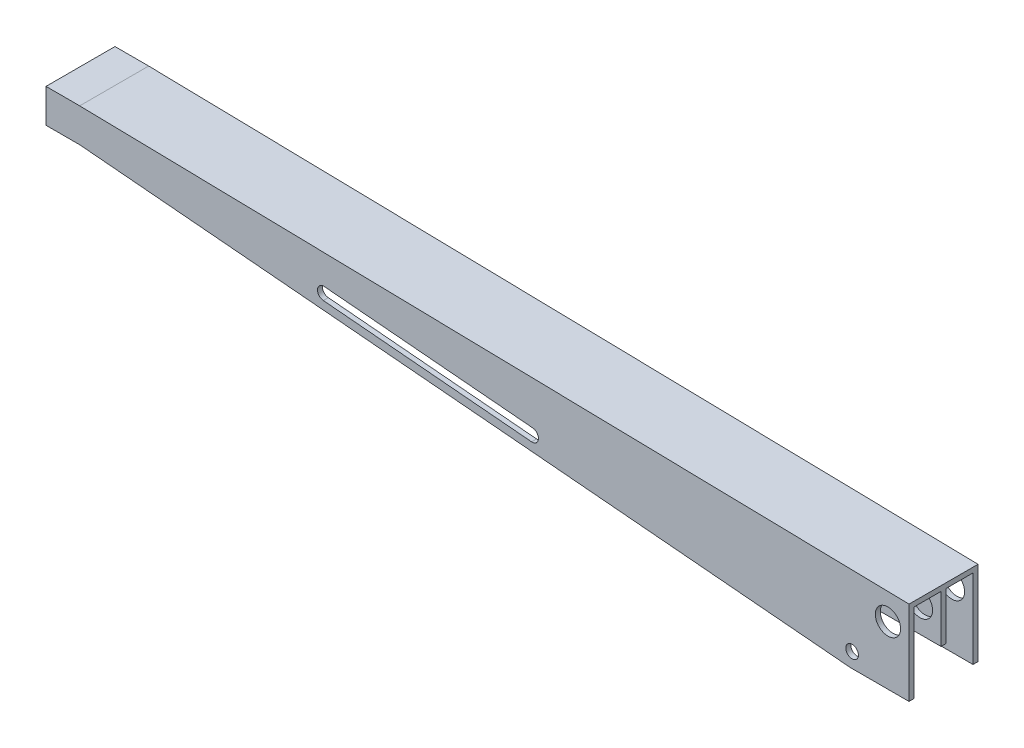
ISO-10303-21;
HEADER;
FILE_DESCRIPTION(('STEP AP214'),'2;1');
FILE_NAME('part.step','',(''),(''),'','','');
FILE_SCHEMA(('AUTOMOTIVE_DESIGN { 1 0 10303 214 1 1 1 1 }'));
ENDSEC;
DATA;
#1=APPLICATION_CONTEXT('core data for automotive mechanical design processes');
#2=APPLICATION_PROTOCOL_DEFINITION('international standard','automotive_design',2000,#1);
#3=PRODUCT_CONTEXT('',#1,'mechanical');
#4=PRODUCT('Part','Part','',(#3));
#5=PRODUCT_RELATED_PRODUCT_CATEGORY('part','',(#4));
#6=PRODUCT_DEFINITION_FORMATION('','',#4);
#7=PRODUCT_DEFINITION_CONTEXT('part definition',#1,'design');
#8=PRODUCT_DEFINITION('design','',#6,#7);
#9=PRODUCT_DEFINITION_SHAPE('','',#8);
#10=(LENGTH_UNIT() NAMED_UNIT(*) SI_UNIT(.MILLI.,.METRE.));
#11=(NAMED_UNIT(*) PLANE_ANGLE_UNIT() SI_UNIT($,.RADIAN.));
#12=(NAMED_UNIT(*) SI_UNIT($,.STERADIAN.) SOLID_ANGLE_UNIT());
#13=UNCERTAINTY_MEASURE_WITH_UNIT(LENGTH_MEASURE(1.E-05),#10,'distance_accuracy_value','');
#14=(GEOMETRIC_REPRESENTATION_CONTEXT(3) GLOBAL_UNCERTAINTY_ASSIGNED_CONTEXT((#13)) GLOBAL_UNIT_ASSIGNED_CONTEXT((#10,
#11,#12)) REPRESENTATION_CONTEXT('',''));
#15=CARTESIAN_POINT('',(0.,0.,0.));
#16=DIRECTION('',(0.,0.,1.));
#17=DIRECTION('',(1.,0.,0.));
#18=AXIS2_PLACEMENT_3D('',#15,#16,#17);
#19=CARTESIAN_POINT('',(0.,0.,177.8));
#20=DIRECTION('',(0.,0.,1.));
#21=DIRECTION('',(1.,0.,0.));
#22=AXIS2_PLACEMENT_3D('',#19,#20,#21);
#23=PLANE('',#22);
#24=DIRECTION('',(-0.999793348363563,0.0203288112779674,0.));
#25=VECTOR('',#24,1.);
#26=CARTESIAN_POINT('',(-15.,239.301894781674,177.8));
#27=LINE('',#26,#25);
#28=CARTESIAN_POINT('',(0.,238.996899584748,177.8));
#29=VERTEX_POINT('',#28);
#30=CARTESIAN_POINT('',(-2498.5524818399,289.8,177.8));
#31=VERTEX_POINT('',#30);
#32=EDGE_CURVE('E431',#29,#31,#27,.T.);
#33=ORIENTED_EDGE('',*,*,#32,.F.);
#34=DIRECTION('',(0.,1.,0.));
#35=VECTOR('',#34,1.);
#36=CARTESIAN_POINT('',(0.,0.,177.8));
#37=LINE('',#36,#35);
#38=CARTESIAN_POINT('',(0.,0.,177.8));
#39=VERTEX_POINT('',#38);
#40=EDGE_CURVE('E413',#39,#29,#37,.T.);
#41=ORIENTED_EDGE('',*,*,#40,.F.);
#42=DIRECTION('',(1.,0.,0.));
#43=VECTOR('',#42,1.);
#44=CARTESIAN_POINT('',(-177.8,0.,177.8));
#45=LINE('',#44,#43);
#46=CARTESIAN_POINT('',(-177.8,0.,177.8));
#47=VERTEX_POINT('',#46);
#48=EDGE_CURVE('E410',#47,#39,#45,.T.);
#49=ORIENTED_EDGE('',*,*,#48,.F.);
#50=DIRECTION('',(0.996188217209835,-0.0872297878725495,0.));
#51=VECTOR('',#50,1.);
#52=CARTESIAN_POINT('',(-2498.4,203.2,177.8));
#53=LINE('',#52,#51);
#54=CARTESIAN_POINT('',(-2498.4,203.2,177.8));
#55=VERTEX_POINT('',#54);
#56=EDGE_CURVE('E407',#55,#47,#53,.T.);
#57=ORIENTED_EDGE('',*,*,#56,.F.);
#58=DIRECTION('',(1.,0.,0.));
#59=VECTOR('',#58,1.);
#60=CARTESIAN_POINT('',(-2600.,203.2,177.8));
#61=LINE('',#60,#59);
#62=CARTESIAN_POINT('',(-2600.,203.2,177.8));
#63=VERTEX_POINT('',#62);
#64=EDGE_CURVE('E400',#63,#55,#61,.T.);
#65=ORIENTED_EDGE('',*,*,#64,.F.);
#66=DIRECTION('',(0.,-1.,0.));
#67=VECTOR('',#66,1.);
#68=CARTESIAN_POINT('',(-2600.,304.8,177.8));
#69=LINE('',#68,#67);
#70=CARTESIAN_POINT('',(-2600.,289.8,177.8));
#71=VERTEX_POINT('',#70);
#72=EDGE_CURVE('E418',#71,#63,#69,.T.);
#73=ORIENTED_EDGE('',*,*,#72,.F.);
#74=DIRECTION('',(-1.,0.,0.));
#75=VECTOR('',#74,1.);
#76=CARTESIAN_POINT('',(-2498.5524818399,289.8,177.8));
#77=LINE('',#76,#75);
#78=EDGE_CURVE('E492',#31,#71,#77,.T.);
#79=ORIENTED_EDGE('',*,*,#78,.F.);
#80=EDGE_LOOP('',(#33,#41,#49,#57,#65,#73,#79));
#81=FACE_BOUND('',#80,.T.);
#82=CARTESIAN_POINT('',(-63.5,176.782795881907,177.8));
#83=DIRECTION('',(0.,0.,1.));
#84=DIRECTION('',(1.,0.,0.));
#85=AXIS2_PLACEMENT_3D('',#82,#83,#84);
#86=CIRCLE('',#85,38.1);
#87=CARTESIAN_POINT('',(-25.4,176.782795881907,177.8));
#88=VERTEX_POINT('',#87);
#89=EDGE_CURVE('E353',#88,#88,#86,.T.);
#90=ORIENTED_EDGE('',*,*,#89,.T.);
#91=EDGE_LOOP('',(#90));
#92=FACE_BOUND('',#91,.T.);
#93=CARTESIAN_POINT('',(-171.45,44.45,177.8));
#94=DIRECTION('',(0.,0.,1.));
#95=DIRECTION('',(1.,0.,0.));
#96=AXIS2_PLACEMENT_3D('',#93,#94,#95);
#97=CIRCLE('',#96,19.05);
#98=CARTESIAN_POINT('',(-152.4,44.45,177.8));
#99=VERTEX_POINT('',#98);
#100=EDGE_CURVE('E318',#99,#99,#97,.T.);
#101=ORIENTED_EDGE('',*,*,#100,.T.);
#102=EDGE_LOOP('',(#101));
#103=FACE_BOUND('',#102,.T.);
#104=CARTESIAN_POINT('',(-1135.45885,127.812391799813,177.8));
#105=DIRECTION('',(0.,0.,1.));
#106=DIRECTION('',(1.,0.,0.));
#107=AXIS2_PLACEMENT_3D('',#104,#105,#106);
#108=CIRCLE('',#107,19.05);
#109=CARTESIAN_POINT('',(-1137.12057745897,108.835006261966,177.8));
#110=VERTEX_POINT('',#109);
#111=CARTESIAN_POINT('',(-1133.79712254103,146.78977733766,177.8));
#112=VERTEX_POINT('',#111);
#113=EDGE_CURVE('E327',#110,#112,#108,.T.);
#114=ORIENTED_EDGE('',*,*,#113,.T.);
#115=DIRECTION('',(-0.996188217209835,0.0872297878725497,0.));
#116=VECTOR('',#115,1.);
#117=CARTESIAN_POINT('',(4.12853039066169,47.1489548453224,177.8));
#118=LINE('',#117,#116);
#119=CARTESIAN_POINT('',(-1761.39569938322,201.744543697367,177.8));
#120=VERTEX_POINT('',#119);
#121=EDGE_CURVE('E324',#112,#120,#118,.T.);
#122=ORIENTED_EDGE('',*,*,#121,.T.);
#123=CARTESIAN_POINT('',(-1763.0574268422,182.767158159519,177.8));
#124=DIRECTION('',(0.,0.,1.));
#125=DIRECTION('',(1.,0.,0.));
#126=AXIS2_PLACEMENT_3D('',#123,#124,#125);
#127=CIRCLE('',#126,19.05);
#128=CARTESIAN_POINT('',(-1764.71915430117,163.789772621672,177.8));
#129=VERTEX_POINT('',#128);
#130=EDGE_CURVE('E319',#120,#129,#127,.T.);
#131=ORIENTED_EDGE('',*,*,#130,.T.);
#132=DIRECTION('',(0.996188217209835,-0.0872297878725497,0.));
#133=VECTOR('',#132,1.);
#134=CARTESIAN_POINT('',(0.805075472717551,9.19418376962768,177.8));
#135=LINE('',#134,#133);
#136=EDGE_CURVE('E315',#129,#110,#135,.T.);
#137=ORIENTED_EDGE('',*,*,#136,.T.);
#138=EDGE_LOOP('',(#114,#122,#131,#137));
#139=FACE_BOUND('',#138,.T.);
#140=ADVANCED_FACE('F64',(#81,#92,#103,#139),#23,.F.);
#141=CARTESIAN_POINT('',(-1135.45885,127.812391799813,192.8));
#142=DIRECTION('',(0.,0.,-1.));
#143=DIRECTION('',(-1.,0.,0.));
#144=AXIS2_PLACEMENT_3D('',#141,#142,#143);
#145=CYLINDRICAL_SURFACE('',#144,19.05);
#146=DIRECTION('',(0.,0.,-1.));
#147=VECTOR('',#146,1.);
#148=CARTESIAN_POINT('',(-1133.79712254103,146.78977733766,192.8));
#149=LINE('',#148,#147);
#150=CARTESIAN_POINT('',(-1133.79712254103,146.78977733766,192.8));
#151=VERTEX_POINT('',#150);
#152=EDGE_CURVE('E306',#151,#112,#149,.T.);
#153=ORIENTED_EDGE('',*,*,#152,.T.);
#154=ORIENTED_EDGE('',*,*,#113,.F.);
#155=DIRECTION('',(0.,0.,-1.));
#156=VECTOR('',#155,1.);
#157=CARTESIAN_POINT('',(-1137.12057745897,108.835006261966,192.8));
#158=LINE('',#157,#156);
#159=CARTESIAN_POINT('',(-1137.12057745897,108.835006261966,192.8));
#160=VERTEX_POINT('',#159);
#161=EDGE_CURVE('E288',#160,#110,#158,.T.);
#162=ORIENTED_EDGE('',*,*,#161,.F.);
#163=CARTESIAN_POINT('',(-1135.45885,127.812391799813,192.8));
#164=DIRECTION('',(0.,0.,-1.));
#165=DIRECTION('',(-1.,0.,0.));
#166=AXIS2_PLACEMENT_3D('',#163,#164,#165);
#167=CIRCLE('',#166,19.05);
#168=EDGE_CURVE('E293',#151,#160,#167,.T.);
#169=ORIENTED_EDGE('',*,*,#168,.F.);
#170=EDGE_LOOP('',(#153,#154,#162,#169));
#171=FACE_BOUND('',#170,.T.);
#172=ADVANCED_FACE('F562',(#171),#145,.F.);
#173=DIRECTION('',(0.,0.,-1.));
#174=VECTOR('',#173,1.);
#175=CARTESIAN_POINT('',(-1133.79712254103,146.78977733766,192.8));
#176=LINE('',#175,#174);
#177=CARTESIAN_POINT('',(-1133.79712254103,146.78977733766,-15.));
#178=VERTEX_POINT('',#177);
#179=CARTESIAN_POINT('',(-1133.79712254103,146.78977733766,0.));
#180=VERTEX_POINT('',#179);
#181=EDGE_CURVE('E332',#178,#180,#176,.F.);
#182=ORIENTED_EDGE('',*,*,#181,.F.);
#183=CARTESIAN_POINT('',(-1135.45885,127.812391799813,-15.));
#184=DIRECTION('',(0.,0.,-1.));
#185=DIRECTION('',(-1.,0.,0.));
#186=AXIS2_PLACEMENT_3D('',#183,#184,#185);
#187=CIRCLE('',#186,19.05);
#188=CARTESIAN_POINT('',(-1137.12057745897,108.835006261966,-15.));
#189=VERTEX_POINT('',#188);
#190=EDGE_CURVE('E345',#189,#178,#187,.F.);
#191=ORIENTED_EDGE('',*,*,#190,.F.);
#192=DIRECTION('',(0.,0.,-1.));
#193=VECTOR('',#192,1.);
#194=CARTESIAN_POINT('',(-1137.12057745897,108.835006261966,192.8));
#195=LINE('',#194,#193);
#196=CARTESIAN_POINT('',(-1137.12057745897,108.835006261966,0.));
#197=VERTEX_POINT('',#196);
#198=EDGE_CURVE('E309',#189,#197,#195,.F.);
#199=ORIENTED_EDGE('',*,*,#198,.T.);
#200=CARTESIAN_POINT('',(-1135.45885,127.812391799813,0.));
#201=DIRECTION('',(0.,0.,1.));
#202=DIRECTION('',(1.,0.,0.));
#203=AXIS2_PLACEMENT_3D('',#200,#201,#202);
#204=CIRCLE('',#203,19.05);
#205=EDGE_CURVE('E335',#197,#180,#204,.T.);
#206=ORIENTED_EDGE('',*,*,#205,.T.);
#207=EDGE_LOOP('',(#182,#191,#199,#206));
#208=FACE_BOUND('',#207,.T.);
#209=ADVANCED_FACE('F527',(#208),#145,.F.);
#210=CARTESIAN_POINT('',(-15.,239.301894781674,-2600.83256824123));
#211=DIRECTION('',(-0.0203288112779674,-0.999793348363563,0.));
#212=DIRECTION('',(0.999793348363563,-0.0203288112779674,0.));
#213=AXIS2_PLACEMENT_3D('',#210,#211,#212);
#214=PLANE('',#213);
#215=DIRECTION('',(0.,0.,1.));
#216=VECTOR('',#215,1.);
#217=CARTESIAN_POINT('',(0.,238.996899584748,-2600.83256824123));
#218=LINE('',#217,#216);
#219=CARTESIAN_POINT('',(0.,238.996899584748,0.));
#220=VERTEX_POINT('',#219);
#221=CARTESIAN_POINT('',(0.,238.996899584748,81.3999999999999));
#222=VERTEX_POINT('',#221);
#223=EDGE_CURVE('E338',#220,#222,#218,.T.);
#224=ORIENTED_EDGE('',*,*,#223,.T.);
#225=DIRECTION('',(-0.999793348363563,0.0203288112779674,0.));
#226=VECTOR('',#225,1.);
#227=CARTESIAN_POINT('',(-15.,239.301894781674,81.3999999999999));
#228=LINE('',#227,#226);
#229=CARTESIAN_POINT('',(-2498.5524818399,289.8,81.3999999999999));
#230=VERTEX_POINT('',#229);
#231=EDGE_CURVE('E392',#222,#230,#228,.T.);
#232=ORIENTED_EDGE('',*,*,#231,.T.);
#233=DIRECTION('',(0.,0.,1.));
#234=VECTOR('',#233,1.);
#235=CARTESIAN_POINT('',(-2498.5524818399,289.8,-2600.83256824123));
#236=LINE('',#235,#234);
#237=CARTESIAN_POINT('',(-2498.5524818399,289.8,0.));
#238=VERTEX_POINT('',#237);
#239=EDGE_CURVE('E391',#238,#230,#236,.T.);
#240=ORIENTED_EDGE('',*,*,#239,.F.);
#241=DIRECTION('',(-0.999793348363563,0.0203288112779674,0.));
#242=VECTOR('',#241,1.);
#243=CARTESIAN_POINT('',(-15.,239.301894781674,0.));
#244=LINE('',#243,#242);
#245=EDGE_CURVE('E439',#220,#238,#244,.T.);
#246=ORIENTED_EDGE('',*,*,#245,.F.);
#247=EDGE_LOOP('',(#224,#232,#240,#246));
#248=FACE_BOUND('',#247,.T.);
#249=ADVANCED_FACE('F638',(#248),#214,.T.);
#250=CARTESIAN_POINT('',(-2498.5524818399,289.8,-2600.83256824123));
#251=DIRECTION('',(0.,-1.,0.));
#252=DIRECTION('',(1.,0.,0.));
#253=AXIS2_PLACEMENT_3D('',#250,#251,#252);
#254=PLANE('',#253);
#255=ORIENTED_EDGE('',*,*,#239,.T.);
#256=DIRECTION('',(-1.,0.,0.));
#257=VECTOR('',#256,1.);
#258=CARTESIAN_POINT('',(-2498.5524818399,289.8,81.3999999999999));
#259=LINE('',#258,#257);
#260=CARTESIAN_POINT('',(-2600.,289.8,81.3999999999999));
#261=VERTEX_POINT('',#260);
#262=EDGE_CURVE('E388',#230,#261,#259,.T.);
#263=ORIENTED_EDGE('',*,*,#262,.T.);
#264=DIRECTION('',(0.,0.,1.));
#265=VECTOR('',#264,1.);
#266=CARTESIAN_POINT('',(-2600.,289.8,-2600.83256824123));
#267=LINE('',#266,#265);
#268=CARTESIAN_POINT('',(-2600.,289.8,0.));
#269=VERTEX_POINT('',#268);
#270=EDGE_CURVE('E383',#269,#261,#267,.T.);
#271=ORIENTED_EDGE('',*,*,#270,.F.);
#272=DIRECTION('',(-1.,0.,0.));
#273=VECTOR('',#272,1.);
#274=CARTESIAN_POINT('',(-2498.5524818399,289.8,0.));
#275=LINE('',#274,#273);
#276=EDGE_CURVE('E435',#238,#269,#275,.T.);
#277=ORIENTED_EDGE('',*,*,#276,.F.);
#278=EDGE_LOOP('',(#255,#263,#271,#277));
#279=FACE_BOUND('',#278,.T.);
#280=ADVANCED_FACE('F635',(#279),#254,.T.);
#281=DIRECTION('',(-0.999793348363563,0.0203288112779674,0.));
#282=VECTOR('',#281,1.);
#283=CARTESIAN_POINT('',(-15.,239.301894781674,96.4));
#284=LINE('',#283,#282);
#285=CARTESIAN_POINT('',(0.,238.996899584748,96.4));
#286=VERTEX_POINT('',#285);
#287=CARTESIAN_POINT('',(-2498.5524818399,289.8,96.4));
#288=VERTEX_POINT('',#287);
#289=EDGE_CURVE('E371',#286,#288,#284,.T.);
#290=ORIENTED_EDGE('',*,*,#289,.F.);
#291=EDGE_CURVE('E390',#286,#29,#218,.T.);
#292=ORIENTED_EDGE('',*,*,#291,.T.);
#293=ORIENTED_EDGE('',*,*,#32,.T.);
#294=EDGE_CURVE('E434',#288,#31,#236,.T.);
#295=ORIENTED_EDGE('',*,*,#294,.F.);
#296=EDGE_LOOP('',(#290,#292,#293,#295));
#297=FACE_BOUND('',#296,.T.);
#298=ADVANCED_FACE('F652',(#297),#214,.T.);
#299=DIRECTION('',(-1.,0.,0.));
#300=VECTOR('',#299,1.);
#301=CARTESIAN_POINT('',(-2498.5524818399,289.8,96.4));
#302=LINE('',#301,#300);
#303=CARTESIAN_POINT('',(-2600.,289.8,96.4));
#304=VERTEX_POINT('',#303);
#305=EDGE_CURVE('E375',#288,#304,#302,.T.);
#306=ORIENTED_EDGE('',*,*,#305,.F.);
#307=ORIENTED_EDGE('',*,*,#294,.T.);
#308=ORIENTED_EDGE('',*,*,#78,.T.);
#309=EDGE_CURVE('E421',#304,#71,#267,.T.);
#310=ORIENTED_EDGE('',*,*,#309,.F.);
#311=EDGE_LOOP('',(#306,#307,#308,#310));
#312=FACE_BOUND('',#311,.T.);
#313=ADVANCED_FACE('F649',(#312),#254,.T.);
#314=CARTESIAN_POINT('',(0.,0.,0.));
#315=DIRECTION('',(0.,0.,1.));
#316=DIRECTION('',(1.,0.,0.));
#317=AXIS2_PLACEMENT_3D('',#314,#315,#316);
#318=PLANE('',#317);
#319=DIRECTION('',(-0.996188217209835,0.0872297878725497,0.));
#320=VECTOR('',#319,1.);
#321=CARTESIAN_POINT('',(4.12853039066169,47.1489548453224,0.));
#322=LINE('',#321,#320);
#323=CARTESIAN_POINT('',(-1761.39569938322,201.744543697367,0.));
#324=VERTEX_POINT('',#323);
#325=EDGE_CURVE('E328',#180,#324,#322,.T.);
#326=ORIENTED_EDGE('',*,*,#325,.F.);
#327=ORIENTED_EDGE('',*,*,#205,.F.);
#328=DIRECTION('',(0.996188217209835,-0.0872297878725497,0.));
#329=VECTOR('',#328,1.);
#330=CARTESIAN_POINT('',(0.805075472717551,9.19418376962768,0.));
#331=LINE('',#330,#329);
#332=CARTESIAN_POINT('',(-1764.71915430117,163.789772621672,0.));
#333=VERTEX_POINT('',#332);
#334=EDGE_CURVE('E320',#333,#197,#331,.T.);
#335=ORIENTED_EDGE('',*,*,#334,.F.);
#336=CARTESIAN_POINT('',(-1763.0574268422,182.767158159519,0.));
#337=DIRECTION('',(0.,0.,1.));
#338=DIRECTION('',(1.,0.,0.));
#339=AXIS2_PLACEMENT_3D('',#336,#337,#338);
#340=CIRCLE('',#339,19.05);
#341=EDGE_CURVE('E330',#324,#333,#340,.T.);
#342=ORIENTED_EDGE('',*,*,#341,.F.);
#343=EDGE_LOOP('',(#326,#327,#335,#342));
#344=FACE_BOUND('',#343,.T.);
#345=CARTESIAN_POINT('',(-171.45,44.45,0.));
#346=DIRECTION('',(0.,0.,1.));
#347=DIRECTION('',(1.,0.,0.));
#348=AXIS2_PLACEMENT_3D('',#345,#346,#347);
#349=CIRCLE('',#348,19.05);
#350=CARTESIAN_POINT('',(-152.4,44.45,0.));
#351=VERTEX_POINT('',#350);
#352=EDGE_CURVE('E349',#351,#351,#349,.T.);
#353=ORIENTED_EDGE('',*,*,#352,.F.);
#354=EDGE_LOOP('',(#353));
#355=FACE_BOUND('',#354,.T.);
#356=CARTESIAN_POINT('',(-63.5,176.782795881907,0.));
#357=DIRECTION('',(0.,0.,1.));
#358=DIRECTION('',(1.,0.,0.));
#359=AXIS2_PLACEMENT_3D('',#356,#357,#358);
#360=CIRCLE('',#359,38.1);
#361=CARTESIAN_POINT('',(-25.4,176.782795881907,0.));
#362=VERTEX_POINT('',#361);
#363=EDGE_CURVE('E350',#362,#362,#360,.T.);
#364=ORIENTED_EDGE('',*,*,#363,.F.);
#365=EDGE_LOOP('',(#364));
#366=FACE_BOUND('',#365,.T.);
#367=DIRECTION('',(0.,1.,0.));
#368=VECTOR('',#367,1.);
#369=CARTESIAN_POINT('',(0.,0.,0.));
#370=LINE('',#369,#368);
#371=CARTESIAN_POINT('',(0.,0.,0.));
#372=VERTEX_POINT('',#371);
#373=EDGE_CURVE('E442',#372,#220,#370,.T.);
#374=ORIENTED_EDGE('',*,*,#373,.T.);
#375=ORIENTED_EDGE('',*,*,#245,.T.);
#376=ORIENTED_EDGE('',*,*,#276,.T.);
#377=DIRECTION('',(0.,-1.,0.));
#378=VECTOR('',#377,1.);
#379=CARTESIAN_POINT('',(-2600.,304.8,0.));
#380=LINE('',#379,#378);
#381=CARTESIAN_POINT('',(-2600.,203.2,0.));
#382=VERTEX_POINT('',#381);
#383=EDGE_CURVE('E438',#269,#382,#380,.T.);
#384=ORIENTED_EDGE('',*,*,#383,.T.);
#385=DIRECTION('',(1.,0.,0.));
#386=VECTOR('',#385,1.);
#387=CARTESIAN_POINT('',(-2600.,203.2,0.));
#388=LINE('',#387,#386);
#389=CARTESIAN_POINT('',(-2498.4,203.2,0.));
#390=VERTEX_POINT('',#389);
#391=EDGE_CURVE('E481',#382,#390,#388,.T.);
#392=ORIENTED_EDGE('',*,*,#391,.T.);
#393=DIRECTION('',(0.996188217209835,-0.0872297878725495,0.));
#394=VECTOR('',#393,1.);
#395=CARTESIAN_POINT('',(-2498.4,203.2,0.));
#396=LINE('',#395,#394);
#397=CARTESIAN_POINT('',(-177.8,0.,0.));
#398=VERTEX_POINT('',#397);
#399=EDGE_CURVE('E484',#390,#398,#396,.T.);
#400=ORIENTED_EDGE('',*,*,#399,.T.);
#401=DIRECTION('',(1.,0.,0.));
#402=VECTOR('',#401,1.);
#403=CARTESIAN_POINT('',(-177.8,0.,0.));
#404=LINE('',#403,#402);
#405=EDGE_CURVE('E487',#398,#372,#404,.T.);
#406=ORIENTED_EDGE('',*,*,#405,.T.);
#407=EDGE_LOOP('',(#374,#375,#376,#384,#392,#400,#406));
#408=FACE_BOUND('',#407,.T.);
#409=ADVANCED_FACE('F536',(#344,#355,#366,#408),#318,.T.);
#410=CARTESIAN_POINT('',(-2600.,304.8,-15.));
#411=DIRECTION('',(-1.,0.,0.));
#412=DIRECTION('',(0.,0.,1.));
#413=AXIS2_PLACEMENT_3D('',#410,#411,#412);
#414=PLANE('',#413);
#415=DIRECTION('',(0.,0.,-1.));
#416=VECTOR('',#415,1.);
#417=CARTESIAN_POINT('',(-2600.,258.823701429964,-15.));
#418=LINE('',#417,#416);
#419=CARTESIAN_POINT('',(-2600.,258.823701429964,96.4));
#420=VERTEX_POINT('',#419);
#421=CARTESIAN_POINT('',(-2600.,258.823701429964,81.4));
#422=VERTEX_POINT('',#421);
#423=EDGE_CURVE('E280',#420,#422,#418,.T.);
#424=ORIENTED_EDGE('',*,*,#423,.F.);
#425=DIRECTION('',(0.,-1.,0.));
#426=VECTOR('',#425,1.);
#427=CARTESIAN_POINT('',(-2600.,304.8,96.4));
#428=LINE('',#427,#426);
#429=EDGE_CURVE('E372',#304,#420,#428,.T.);
#430=ORIENTED_EDGE('',*,*,#429,.F.);
#431=ORIENTED_EDGE('',*,*,#309,.T.);
#432=ORIENTED_EDGE('',*,*,#72,.T.);
#433=DIRECTION('',(0.,0.,-1.));
#434=VECTOR('',#433,1.);
#435=CARTESIAN_POINT('',(-2600.,203.2,192.8));
#436=LINE('',#435,#434);
#437=CARTESIAN_POINT('',(-2600.,203.2,192.8));
#438=VERTEX_POINT('',#437);
#439=EDGE_CURVE('E406',#438,#63,#436,.T.);
#440=ORIENTED_EDGE('',*,*,#439,.F.);
#441=DIRECTION('',(0.,-1.,0.));
#442=VECTOR('',#441,1.);
#443=CARTESIAN_POINT('',(-2600.,289.8,192.8));
#444=LINE('',#443,#442);
#445=CARTESIAN_POINT('',(-2600.,304.8,192.8));
#446=VERTEX_POINT('',#445);
#447=EDGE_CURVE('E398',#446,#438,#444,.T.);
#448=ORIENTED_EDGE('',*,*,#447,.F.);
#449=DIRECTION('',(0.,0.,1.));
#450=VECTOR('',#449,1.);
#451=CARTESIAN_POINT('',(-2600.,304.8,-15.));
#452=LINE('',#451,#450);
#453=CARTESIAN_POINT('',(-2600.,304.8,-15.));
#454=VERTEX_POINT('',#453);
#455=EDGE_CURVE('E477',#454,#446,#452,.T.);
#456=ORIENTED_EDGE('',*,*,#455,.F.);
#457=DIRECTION('',(0.,-1.,0.));
#458=VECTOR('',#457,1.);
#459=CARTESIAN_POINT('',(-2600.,304.8,-15.));
#460=LINE('',#459,#458);
#461=CARTESIAN_POINT('',(-2600.,203.2,-15.));
#462=VERTEX_POINT('',#461);
#463=EDGE_CURVE('E420',#454,#462,#460,.T.);
#464=ORIENTED_EDGE('',*,*,#463,.T.);
#465=DIRECTION('',(0.,0.,1.));
#466=VECTOR('',#465,1.);
#467=CARTESIAN_POINT('',(-2600.,203.2,-15.));
#468=LINE('',#467,#466);
#469=EDGE_CURVE('E458',#462,#382,#468,.T.);
#470=ORIENTED_EDGE('',*,*,#469,.T.);
#471=ORIENTED_EDGE('',*,*,#383,.F.);
#472=ORIENTED_EDGE('',*,*,#270,.T.);
#473=DIRECTION('',(0.,-1.,0.));
#474=VECTOR('',#473,1.);
#475=CARTESIAN_POINT('',(-2600.,304.8,81.4));
#476=LINE('',#475,#474);
#477=EDGE_CURVE('E379',#261,#422,#476,.T.);
#478=ORIENTED_EDGE('',*,*,#477,.T.);
#479=EDGE_LOOP('',(#424,#430,#431,#432,#440,#448,#456,#464,#470,#471,#472,#478));
#480=FACE_BOUND('',#479,.T.);
#481=ADVANCED_FACE('F630',(#480),#414,.T.);
#482=CARTESIAN_POINT('',(-2600.,304.8,-15.));
#483=DIRECTION('',(0.,1.,0.));
#484=DIRECTION('',(-1.,0.,0.));
#485=AXIS2_PLACEMENT_3D('',#482,#483,#484);
#486=PLANE('',#485);
#487=DIRECTION('',(-1.,0.,0.));
#488=VECTOR('',#487,1.);
#489=CARTESIAN_POINT('',(-2600.,304.8,192.8));
#490=LINE('',#489,#488);
#491=CARTESIAN_POINT('',(-2498.4,304.8,192.8));
#492=VERTEX_POINT('',#491);
#493=EDGE_CURVE('E443',#492,#446,#490,.T.);
#494=ORIENTED_EDGE('',*,*,#493,.F.);
#495=DIRECTION('',(0.,0.,1.));
#496=VECTOR('',#495,1.);
#497=CARTESIAN_POINT('',(-2498.4,304.8,-15.));
#498=LINE('',#497,#496);
#499=CARTESIAN_POINT('',(-2498.4,304.8,-15.));
#500=VERTEX_POINT('',#499);
#501=EDGE_CURVE('E378',#500,#492,#498,.T.);
#502=ORIENTED_EDGE('',*,*,#501,.F.);
#503=DIRECTION('',(-1.,0.,0.));
#504=VECTOR('',#503,1.);
#505=CARTESIAN_POINT('',(-2600.,304.8,-15.));
#506=LINE('',#505,#504);
#507=EDGE_CURVE('E382',#500,#454,#506,.T.);
#508=ORIENTED_EDGE('',*,*,#507,.T.);
#509=ORIENTED_EDGE('',*,*,#455,.T.);
#510=EDGE_LOOP('',(#494,#502,#508,#509));
#511=FACE_BOUND('',#510,.T.);
#512=ADVANCED_FACE('F609',(#511),#486,.T.);
#513=CARTESIAN_POINT('',(0.,254.,-15.));
#514=DIRECTION('',(0.0203288112779655,0.999793348363563,0.));
#515=DIRECTION('',(-0.999793348363563,0.0203288112779655,0.));
#516=AXIS2_PLACEMENT_3D('',#513,#514,#515);
#517=PLANE('',#516);
#518=DIRECTION('',(-0.999793348363563,0.0203288112779655,0.));
#519=VECTOR('',#518,1.);
#520=CARTESIAN_POINT('',(-2498.4,304.8,192.8));
#521=LINE('',#520,#519);
#522=CARTESIAN_POINT('',(0.,254.,192.8));
#523=VERTEX_POINT('',#522);
#524=EDGE_CURVE('E446',#523,#492,#521,.T.);
#525=ORIENTED_EDGE('',*,*,#524,.F.);
#526=DIRECTION('',(0.,0.,1.));
#527=VECTOR('',#526,1.);
#528=CARTESIAN_POINT('',(0.,254.,-15.));
#529=LINE('',#528,#527);
#530=CARTESIAN_POINT('',(0.,254.,-15.));
#531=VERTEX_POINT('',#530);
#532=EDGE_CURVE('E426',#531,#523,#529,.T.);
#533=ORIENTED_EDGE('',*,*,#532,.F.);
#534=DIRECTION('',(-0.999793348363563,0.0203288112779655,0.));
#535=VECTOR('',#534,1.);
#536=CARTESIAN_POINT('',(0.,254.,-15.));
#537=LINE('',#536,#535);
#538=EDGE_CURVE('E474',#531,#500,#537,.T.);
#539=ORIENTED_EDGE('',*,*,#538,.T.);
#540=ORIENTED_EDGE('',*,*,#501,.T.);
#541=EDGE_LOOP('',(#525,#533,#539,#540));
#542=FACE_BOUND('',#541,.T.);
#543=ADVANCED_FACE('F613',(#542),#517,.T.);
#544=CARTESIAN_POINT('',(0.,0.,-15.));
#545=DIRECTION('',(1.,0.,0.));
#546=DIRECTION('',(0.,0.,-1.));
#547=AXIS2_PLACEMENT_3D('',#544,#545,#546);
#548=PLANE('',#547);
#549=DIRECTION('',(0.,0.,1.));
#550=VECTOR('',#549,1.);
#551=CARTESIAN_POINT('',(0.,95.25,-1187.76053470456));
#552=LINE('',#551,#550);
#553=CARTESIAN_POINT('',(0.,95.25,81.3999999999999));
#554=VERTEX_POINT('',#553);
#555=CARTESIAN_POINT('',(0.,95.25,96.4));
#556=VERTEX_POINT('',#555);
#557=EDGE_CURVE('E279',#554,#556,#552,.T.);
#558=ORIENTED_EDGE('',*,*,#557,.F.);
#559=DIRECTION('',(0.,1.,0.));
#560=VECTOR('',#559,1.);
#561=CARTESIAN_POINT('',(0.,0.,81.4));
#562=LINE('',#561,#560);
#563=EDGE_CURVE('E278',#554,#222,#562,.T.);
#564=ORIENTED_EDGE('',*,*,#563,.T.);
#565=ORIENTED_EDGE('',*,*,#223,.F.);
#566=ORIENTED_EDGE('',*,*,#373,.F.);
#567=DIRECTION('',(0.,0.,1.));
#568=VECTOR('',#567,1.);
#569=CARTESIAN_POINT('',(0.,0.,-15.));
#570=LINE('',#569,#568);
#571=CARTESIAN_POINT('',(0.,0.,-15.));
#572=VERTEX_POINT('',#571);
#573=EDGE_CURVE('E469',#572,#372,#570,.T.);
#574=ORIENTED_EDGE('',*,*,#573,.F.);
#575=DIRECTION('',(0.,1.,0.));
#576=VECTOR('',#575,1.);
#577=CARTESIAN_POINT('',(0.,0.,-15.));
#578=LINE('',#577,#576);
#579=EDGE_CURVE('E377',#572,#531,#578,.T.);
#580=ORIENTED_EDGE('',*,*,#579,.T.);
#581=ORIENTED_EDGE('',*,*,#532,.T.);
#582=DIRECTION('',(0.,1.,0.));
#583=VECTOR('',#582,1.);
#584=CARTESIAN_POINT('',(0.,238.996899584748,192.8));
#585=LINE('',#584,#583);
#586=CARTESIAN_POINT('',(0.,0.,192.8));
#587=VERTEX_POINT('',#586);
#588=EDGE_CURVE('E403',#587,#523,#585,.T.);
#589=ORIENTED_EDGE('',*,*,#588,.F.);
#590=DIRECTION('',(0.,0.,-1.));
#591=VECTOR('',#590,1.);
#592=CARTESIAN_POINT('',(0.,0.,192.8));
#593=LINE('',#592,#591);
#594=EDGE_CURVE('E417',#587,#39,#593,.T.);
#595=ORIENTED_EDGE('',*,*,#594,.T.);
#596=ORIENTED_EDGE('',*,*,#40,.T.);
#597=ORIENTED_EDGE('',*,*,#291,.F.);
#598=DIRECTION('',(0.,1.,0.));
#599=VECTOR('',#598,1.);
#600=CARTESIAN_POINT('',(0.,0.,96.4));
#601=LINE('',#600,#599);
#602=EDGE_CURVE('E365',#556,#286,#601,.T.);
#603=ORIENTED_EDGE('',*,*,#602,.F.);
#604=EDGE_LOOP('',(#558,#564,#565,#566,#574,#580,#581,#589,#595,#596,#597,#603));
#605=FACE_BOUND('',#604,.T.);
#606=ADVANCED_FACE('F617',(#605),#548,.T.);
#607=CARTESIAN_POINT('',(-177.8,0.,-15.));
#608=DIRECTION('',(0.,-1.,0.));
#609=DIRECTION('',(0.,0.,-1.));
#610=AXIS2_PLACEMENT_3D('',#607,#608,#609);
#611=PLANE('',#610);
#612=ORIENTED_EDGE('',*,*,#405,.F.);
#613=DIRECTION('',(0.,0.,1.));
#614=VECTOR('',#613,1.);
#615=CARTESIAN_POINT('',(-177.8,0.,-15.));
#616=LINE('',#615,#614);
#617=CARTESIAN_POINT('',(-177.8,0.,-15.));
#618=VERTEX_POINT('',#617);
#619=EDGE_CURVE('E465',#618,#398,#616,.T.);
#620=ORIENTED_EDGE('',*,*,#619,.F.);
#621=DIRECTION('',(1.,0.,0.));
#622=VECTOR('',#621,1.);
#623=CARTESIAN_POINT('',(-177.8,0.,-15.));
#624=LINE('',#623,#622);
#625=EDGE_CURVE('E416',#618,#572,#624,.T.);
#626=ORIENTED_EDGE('',*,*,#625,.T.);
#627=ORIENTED_EDGE('',*,*,#573,.T.);
#628=EDGE_LOOP('',(#612,#620,#626,#627));
#629=FACE_BOUND('',#628,.T.);
#630=ADVANCED_FACE('F622',(#629),#611,.T.);
#631=CARTESIAN_POINT('',(-2498.4,203.2,-15.));
#632=DIRECTION('',(-0.0872297878725495,-0.996188217209835,0.));
#633=DIRECTION('',(0.996188217209835,-0.0872297878725495,0.));
#634=AXIS2_PLACEMENT_3D('',#631,#632,#633);
#635=PLANE('',#634);
#636=ORIENTED_EDGE('',*,*,#399,.F.);
#637=DIRECTION('',(0.,0.,1.));
#638=VECTOR('',#637,1.);
#639=CARTESIAN_POINT('',(-2498.4,203.2,-15.));
#640=LINE('',#639,#638);
#641=CARTESIAN_POINT('',(-2498.4,203.2,-15.));
#642=VERTEX_POINT('',#641);
#643=EDGE_CURVE('E464',#642,#390,#640,.T.);
#644=ORIENTED_EDGE('',*,*,#643,.F.);
#645=DIRECTION('',(0.996188217209835,-0.0872297878725495,0.));
#646=VECTOR('',#645,1.);
#647=CARTESIAN_POINT('',(-2498.4,203.2,-15.));
#648=LINE('',#647,#646);
#649=EDGE_CURVE('E466',#642,#618,#648,.T.);
#650=ORIENTED_EDGE('',*,*,#649,.T.);
#651=ORIENTED_EDGE('',*,*,#619,.T.);
#652=EDGE_LOOP('',(#636,#644,#650,#651));
#653=FACE_BOUND('',#652,.T.);
#654=ADVANCED_FACE('F625',(#653),#635,.T.);
#655=CARTESIAN_POINT('',(-2600.,203.2,-15.));
#656=DIRECTION('',(0.,-1.,0.));
#657=DIRECTION('',(0.,0.,-1.));
#658=AXIS2_PLACEMENT_3D('',#655,#656,#657);
#659=PLANE('',#658);
#660=ORIENTED_EDGE('',*,*,#391,.F.);
#661=ORIENTED_EDGE('',*,*,#469,.F.);
#662=DIRECTION('',(1.,0.,0.));
#663=VECTOR('',#662,1.);
#664=CARTESIAN_POINT('',(-2600.,203.2,-15.));
#665=LINE('',#664,#663);
#666=EDGE_CURVE('E461',#462,#642,#665,.T.);
#667=ORIENTED_EDGE('',*,*,#666,.T.);
#668=ORIENTED_EDGE('',*,*,#643,.T.);
#669=EDGE_LOOP('',(#660,#661,#667,#668));
#670=FACE_BOUND('',#669,.T.);
#671=ADVANCED_FACE('F597',(#670),#659,.T.);
#672=CARTESIAN_POINT('',(0.,0.,-15.));
#673=DIRECTION('',(0.,0.,1.));
#674=DIRECTION('',(1.,0.,0.));
#675=AXIS2_PLACEMENT_3D('',#672,#673,#674);
#676=PLANE('',#675);
#677=ORIENTED_EDGE('',*,*,#190,.T.);
#678=DIRECTION('',(-0.996188217209835,0.0872297878725497,0.));
#679=VECTOR('',#678,1.);
#680=CARTESIAN_POINT('',(-1133.79712254103,146.78977733766,-15.));
#681=LINE('',#680,#679);
#682=CARTESIAN_POINT('',(-1761.39569938322,201.744543697367,-15.));
#683=VERTEX_POINT('',#682);
#684=EDGE_CURVE('E511',#683,#178,#681,.F.);
#685=ORIENTED_EDGE('',*,*,#684,.F.);
#686=CARTESIAN_POINT('',(-1763.0574268422,182.767158159519,-15.));
#687=DIRECTION('',(0.,0.,-1.));
#688=DIRECTION('',(-1.,0.,0.));
#689=AXIS2_PLACEMENT_3D('',#686,#687,#688);
#690=CIRCLE('',#689,19.05);
#691=CARTESIAN_POINT('',(-1764.71915430117,163.789772621672,-15.));
#692=VERTEX_POINT('',#691);
#693=EDGE_CURVE('E313',#692,#683,#690,.T.);
#694=ORIENTED_EDGE('',*,*,#693,.F.);
#695=DIRECTION('',(0.996188217209835,-0.0872297878725497,0.));
#696=VECTOR('',#695,1.);
#697=CARTESIAN_POINT('',(-1137.12057745897,108.835006261966,-15.));
#698=LINE('',#697,#696);
#699=EDGE_CURVE('E322',#189,#692,#698,.F.);
#700=ORIENTED_EDGE('',*,*,#699,.F.);
#701=EDGE_LOOP('',(#677,#685,#694,#700));
#702=FACE_BOUND('',#701,.T.);
#703=CARTESIAN_POINT('',(-171.45,44.45,-15.));
#704=DIRECTION('',(0.,0.,1.));
#705=DIRECTION('',(1.,0.,0.));
#706=AXIS2_PLACEMENT_3D('',#703,#704,#705);
#707=CIRCLE('',#706,19.05);
#708=CARTESIAN_POINT('',(-152.4,44.45,-15.));
#709=VERTEX_POINT('',#708);
#710=EDGE_CURVE('E342',#709,#709,#707,.T.);
#711=ORIENTED_EDGE('',*,*,#710,.T.);
#712=EDGE_LOOP('',(#711));
#713=FACE_BOUND('',#712,.T.);
#714=CARTESIAN_POINT('',(-63.5,176.782795881907,-15.));
#715=DIRECTION('',(0.,0.,1.));
#716=DIRECTION('',(1.,0.,0.));
#717=AXIS2_PLACEMENT_3D('',#714,#715,#716);
#718=CIRCLE('',#717,38.1);
#719=CARTESIAN_POINT('',(-25.4,176.782795881907,-15.));
#720=VERTEX_POINT('',#719);
#721=EDGE_CURVE('E300',#720,#720,#718,.T.);
#722=ORIENTED_EDGE('',*,*,#721,.T.);
#723=EDGE_LOOP('',(#722));
#724=FACE_BOUND('',#723,.T.);
#725=ORIENTED_EDGE('',*,*,#463,.F.);
#726=ORIENTED_EDGE('',*,*,#507,.F.);
#727=ORIENTED_EDGE('',*,*,#538,.F.);
#728=ORIENTED_EDGE('',*,*,#579,.F.);
#729=ORIENTED_EDGE('',*,*,#625,.F.);
#730=ORIENTED_EDGE('',*,*,#649,.F.);
#731=ORIENTED_EDGE('',*,*,#666,.F.);
#732=EDGE_LOOP('',(#725,#726,#727,#728,#729,#730,#731));
#733=FACE_BOUND('',#732,.T.);
#734=ADVANCED_FACE('F522',(#702,#713,#724,#733),#676,.F.);
#735=CARTESIAN_POINT('',(0.,0.,192.8));
#736=DIRECTION('',(0.,0.,1.));
#737=DIRECTION('',(1.,0.,0.));
#738=AXIS2_PLACEMENT_3D('',#735,#736,#737);
#739=PLANE('',#738);
#740=DIRECTION('',(0.996188217209835,-0.0872297878725497,0.));
#741=VECTOR('',#740,1.);
#742=CARTESIAN_POINT('',(-1133.79712254103,146.78977733766,192.8));
#743=LINE('',#742,#741);
#744=CARTESIAN_POINT('',(-1761.39569938322,201.744543697367,192.8));
#745=VERTEX_POINT('',#744);
#746=EDGE_CURVE('E297',#745,#151,#743,.T.);
#747=ORIENTED_EDGE('',*,*,#746,.T.);
#748=ORIENTED_EDGE('',*,*,#168,.T.);
#749=DIRECTION('',(-0.996188217209835,0.0872297878725497,0.));
#750=VECTOR('',#749,1.);
#751=CARTESIAN_POINT('',(-1137.12057745897,108.835006261966,192.8));
#752=LINE('',#751,#750);
#753=CARTESIAN_POINT('',(-1764.71915430117,163.789772621672,192.8));
#754=VERTEX_POINT('',#753);
#755=EDGE_CURVE('E289',#160,#754,#752,.T.);
#756=ORIENTED_EDGE('',*,*,#755,.T.);
#757=CARTESIAN_POINT('',(-1763.0574268422,182.767158159519,192.8));
#758=DIRECTION('',(0.,0.,-1.));
#759=DIRECTION('',(-1.,0.,0.));
#760=AXIS2_PLACEMENT_3D('',#757,#758,#759);
#761=CIRCLE('',#760,19.05);
#762=EDGE_CURVE('E292',#754,#745,#761,.T.);
#763=ORIENTED_EDGE('',*,*,#762,.T.);
#764=EDGE_LOOP('',(#747,#748,#756,#763));
#765=FACE_BOUND('',#764,.T.);
#766=CARTESIAN_POINT('',(-171.45,44.45,192.8));
#767=DIRECTION('',(0.,0.,1.));
#768=DIRECTION('',(1.,0.,0.));
#769=AXIS2_PLACEMENT_3D('',#766,#767,#768);
#770=CIRCLE('',#769,19.05);
#771=CARTESIAN_POINT('',(-152.4,44.45,192.8));
#772=VERTEX_POINT('',#771);
#773=EDGE_CURVE('E346',#772,#772,#770,.T.);
#774=ORIENTED_EDGE('',*,*,#773,.F.);
#775=EDGE_LOOP('',(#774));
#776=FACE_BOUND('',#775,.T.);
#777=CARTESIAN_POINT('',(-63.5,176.782795881907,192.8));
#778=DIRECTION('',(0.,0.,1.));
#779=DIRECTION('',(1.,0.,0.));
#780=AXIS2_PLACEMENT_3D('',#777,#778,#779);
#781=CIRCLE('',#780,38.1);
#782=CARTESIAN_POINT('',(-25.4,176.782795881907,192.8));
#783=VERTEX_POINT('',#782);
#784=EDGE_CURVE('E358',#783,#783,#781,.T.);
#785=ORIENTED_EDGE('',*,*,#784,.F.);
#786=EDGE_LOOP('',(#785));
#787=FACE_BOUND('',#786,.T.);
#788=DIRECTION('',(1.,0.,0.));
#789=VECTOR('',#788,1.);
#790=CARTESIAN_POINT('',(-177.8,0.,192.8));
#791=LINE('',#790,#789);
#792=CARTESIAN_POINT('',(-177.8,0.,192.8));
#793=VERTEX_POINT('',#792);
#794=EDGE_CURVE('E296',#793,#587,#791,.T.);
#795=ORIENTED_EDGE('',*,*,#794,.T.);
#796=ORIENTED_EDGE('',*,*,#588,.T.);
#797=ORIENTED_EDGE('',*,*,#524,.T.);
#798=ORIENTED_EDGE('',*,*,#493,.T.);
#799=ORIENTED_EDGE('',*,*,#447,.T.);
#800=DIRECTION('',(1.,0.,0.));
#801=VECTOR('',#800,1.);
#802=CARTESIAN_POINT('',(-2600.,203.2,192.8));
#803=LINE('',#802,#801);
#804=CARTESIAN_POINT('',(-2498.4,203.2,192.8));
#805=VERTEX_POINT('',#804);
#806=EDGE_CURVE('E394',#438,#805,#803,.T.);
#807=ORIENTED_EDGE('',*,*,#806,.T.);
#808=DIRECTION('',(0.996188217209835,-0.0872297878725495,0.));
#809=VECTOR('',#808,1.);
#810=CARTESIAN_POINT('',(-2498.4,203.2,192.8));
#811=LINE('',#810,#809);
#812=EDGE_CURVE('E397',#805,#793,#811,.T.);
#813=ORIENTED_EDGE('',*,*,#812,.T.);
#814=EDGE_LOOP('',(#795,#796,#797,#798,#799,#807,#813));
#815=FACE_BOUND('',#814,.T.);
#816=ADVANCED_FACE('F596',(#765,#776,#787,#815),#739,.T.);
#817=CARTESIAN_POINT('',(-2600.,203.2,192.8));
#818=DIRECTION('',(0.,1.,0.));
#819=DIRECTION('',(0.,0.,1.));
#820=AXIS2_PLACEMENT_3D('',#817,#818,#819);
#821=PLANE('',#820);
#822=ORIENTED_EDGE('',*,*,#64,.T.);
#823=DIRECTION('',(0.,0.,-1.));
#824=VECTOR('',#823,1.);
#825=CARTESIAN_POINT('',(-2498.4,203.2,192.8));
#826=LINE('',#825,#824);
#827=EDGE_CURVE('E409',#805,#55,#826,.T.);
#828=ORIENTED_EDGE('',*,*,#827,.F.);
#829=ORIENTED_EDGE('',*,*,#806,.F.);
#830=ORIENTED_EDGE('',*,*,#439,.T.);
#831=EDGE_LOOP('',(#822,#828,#829,#830));
#832=FACE_BOUND('',#831,.T.);
#833=ADVANCED_FACE('F668',(#832),#821,.F.);
#834=CARTESIAN_POINT('',(-2498.4,203.2,192.8));
#835=DIRECTION('',(0.0872297878725495,0.996188217209835,0.));
#836=DIRECTION('',(-0.996188217209835,0.0872297878725495,0.));
#837=AXIS2_PLACEMENT_3D('',#834,#835,#836);
#838=PLANE('',#837);
#839=ORIENTED_EDGE('',*,*,#56,.T.);
#840=DIRECTION('',(0.,0.,-1.));
#841=VECTOR('',#840,1.);
#842=CARTESIAN_POINT('',(-177.8,0.,192.8));
#843=LINE('',#842,#841);
#844=EDGE_CURVE('E412',#793,#47,#843,.T.);
#845=ORIENTED_EDGE('',*,*,#844,.F.);
#846=ORIENTED_EDGE('',*,*,#812,.F.);
#847=ORIENTED_EDGE('',*,*,#827,.T.);
#848=EDGE_LOOP('',(#839,#845,#846,#847));
#849=FACE_BOUND('',#848,.T.);
#850=ADVANCED_FACE('F665',(#849),#838,.F.);
#851=CARTESIAN_POINT('',(-177.8,0.,192.8));
#852=DIRECTION('',(0.,1.,0.));
#853=DIRECTION('',(0.,0.,1.));
#854=AXIS2_PLACEMENT_3D('',#851,#852,#853);
#855=PLANE('',#854);
#856=ORIENTED_EDGE('',*,*,#48,.T.);
#857=ORIENTED_EDGE('',*,*,#594,.F.);
#858=ORIENTED_EDGE('',*,*,#794,.F.);
#859=ORIENTED_EDGE('',*,*,#844,.T.);
#860=EDGE_LOOP('',(#856,#857,#858,#859));
#861=FACE_BOUND('',#860,.T.);
#862=ADVANCED_FACE('F573',(#861),#855,.F.);
#863=CARTESIAN_POINT('',(0.,0.,81.4));
#864=DIRECTION('',(0.,0.,1.));
#865=DIRECTION('',(1.,0.,0.));
#866=AXIS2_PLACEMENT_3D('',#863,#864,#865);
#867=PLANE('',#866);
#868=CARTESIAN_POINT('',(-63.5,176.782795881907,81.4));
#869=DIRECTION('',(0.,0.,1.));
#870=DIRECTION('',(1.,0.,0.));
#871=AXIS2_PLACEMENT_3D('',#868,#869,#870);
#872=CIRCLE('',#871,38.1);
#873=CARTESIAN_POINT('',(-25.4,176.782795881907,81.4));
#874=VERTEX_POINT('',#873);
#875=EDGE_CURVE('E362',#874,#874,#872,.T.);
#876=ORIENTED_EDGE('',*,*,#875,.T.);
#877=EDGE_LOOP('',(#876));
#878=FACE_BOUND('',#877,.T.);
#879=DIRECTION('',(1.,0.,0.));
#880=VECTOR('',#879,1.);
#881=CARTESIAN_POINT('',(-1265.58125,95.25,81.3999999999999));
#882=LINE('',#881,#880);
#883=CARTESIAN_POINT('',(-1051.79535153661,95.25,81.4));
#884=VERTEX_POINT('',#883);
#885=EDGE_CURVE('E272',#884,#554,#882,.T.);
#886=ORIENTED_EDGE('',*,*,#885,.F.);
#887=DIRECTION('',(0.,-1.,0.));
#888=VECTOR('',#887,1.);
#889=CARTESIAN_POINT('',(-1051.79535153661,0.,81.4));
#890=LINE('',#889,#888);
#891=CARTESIAN_POINT('',(-1051.79535153661,201.776969348915,81.4));
#892=VERTEX_POINT('',#891);
#893=EDGE_CURVE('E259',#892,#884,#890,.T.);
#894=ORIENTED_EDGE('',*,*,#893,.F.);
#895=DIRECTION('',(1.,0.,0.));
#896=VECTOR('',#895,1.);
#897=CARTESIAN_POINT('',(0.,201.776969348915,81.4));
#898=LINE('',#897,#896);
#899=CARTESIAN_POINT('',(-1091.72043101631,201.776969348915,81.4));
#900=VERTEX_POINT('',#899);
#901=EDGE_CURVE('E12',#900,#892,#898,.T.);
#902=ORIENTED_EDGE('',*,*,#901,.F.);
#903=DIRECTION('',(0.999285500053387,-0.037795361925133,0.));
#904=VECTOR('',#903,1.);
#905=CARTESIAN_POINT('',(-1249.09164809373,207.729124269328,81.4));
#906=LINE('',#905,#904);
#907=EDGE_CURVE('E339',#422,#900,#906,.T.);
#908=ORIENTED_EDGE('',*,*,#907,.F.);
#909=ORIENTED_EDGE('',*,*,#477,.F.);
#910=ORIENTED_EDGE('',*,*,#262,.F.);
#911=ORIENTED_EDGE('',*,*,#231,.F.);
#912=ORIENTED_EDGE('',*,*,#563,.F.);
#913=EDGE_LOOP('',(#886,#894,#902,#908,#909,#910,#911,#912));
#914=FACE_BOUND('',#913,.T.);
#915=ADVANCED_FACE('F66',(#878,#914),#867,.F.);
#916=CARTESIAN_POINT('',(0.,0.,96.4));
#917=DIRECTION('',(0.,0.,1.));
#918=DIRECTION('',(1.,0.,0.));
#919=AXIS2_PLACEMENT_3D('',#916,#917,#918);
#920=PLANE('',#919);
#921=DIRECTION('',(0.,1.,0.));
#922=VECTOR('',#921,1.);
#923=CARTESIAN_POINT('',(-1051.79535153661,0.,96.4));
#924=LINE('',#923,#922);
#925=CARTESIAN_POINT('',(-1051.79535153661,95.25,96.4));
#926=VERTEX_POINT('',#925);
#927=CARTESIAN_POINT('',(-1051.79535153661,201.776969348915,96.4));
#928=VERTEX_POINT('',#927);
#929=EDGE_CURVE('E285',#926,#928,#924,.T.);
#930=ORIENTED_EDGE('',*,*,#929,.F.);
#931=DIRECTION('',(-1.,0.,0.));
#932=VECTOR('',#931,1.);
#933=CARTESIAN_POINT('',(-1265.58125,95.25,96.4));
#934=LINE('',#933,#932);
#935=EDGE_CURVE('E68',#556,#926,#934,.T.);
#936=ORIENTED_EDGE('',*,*,#935,.F.);
#937=ORIENTED_EDGE('',*,*,#602,.T.);
#938=ORIENTED_EDGE('',*,*,#289,.T.);
#939=ORIENTED_EDGE('',*,*,#305,.T.);
#940=ORIENTED_EDGE('',*,*,#429,.T.);
#941=DIRECTION('',(-0.999285500053387,0.037795361925133,0.));
#942=VECTOR('',#941,1.);
#943=CARTESIAN_POINT('',(6.06127359624208,160.256245953646,96.4));
#944=LINE('',#943,#942);
#945=CARTESIAN_POINT('',(-1091.72043101631,201.776969348915,96.4));
#946=VERTEX_POINT('',#945);
#947=EDGE_CURVE('E323',#946,#420,#944,.T.);
#948=ORIENTED_EDGE('',*,*,#947,.F.);
#949=DIRECTION('',(-1.,0.,0.));
#950=VECTOR('',#949,1.);
#951=CARTESIAN_POINT('',(0.,201.776969348915,96.4));
#952=LINE('',#951,#950);
#953=EDGE_CURVE('E267',#928,#946,#952,.T.);
#954=ORIENTED_EDGE('',*,*,#953,.F.);
#955=EDGE_LOOP('',(#930,#936,#937,#938,#939,#940,#948,#954));
#956=FACE_BOUND('',#955,.T.);
#957=CARTESIAN_POINT('',(-63.5,176.782795881907,96.4));
#958=DIRECTION('',(0.,0.,1.));
#959=DIRECTION('',(1.,0.,0.));
#960=AXIS2_PLACEMENT_3D('',#957,#958,#959);
#961=CIRCLE('',#960,38.1);
#962=CARTESIAN_POINT('',(-25.4,176.782795881907,96.4));
#963=VERTEX_POINT('',#962);
#964=EDGE_CURVE('E361',#963,#963,#961,.T.);
#965=ORIENTED_EDGE('',*,*,#964,.F.);
#966=EDGE_LOOP('',(#965));
#967=FACE_BOUND('',#966,.T.);
#968=ADVANCED_FACE('F643',(#956,#967),#920,.T.);
#969=CARTESIAN_POINT('',(-63.5,176.782795881907,-15.));
#970=DIRECTION('',(0.,0.,1.));
#971=DIRECTION('',(1.,0.,0.));
#972=AXIS2_PLACEMENT_3D('',#969,#970,#971);
#973=CYLINDRICAL_SURFACE('',#972,38.1);
#974=ORIENTED_EDGE('',*,*,#964,.T.);
#975=EDGE_LOOP('',(#974));
#976=FACE_BOUND('',#975,.T.);
#977=ORIENTED_EDGE('',*,*,#875,.F.);
#978=EDGE_LOOP('',(#977));
#979=FACE_BOUND('',#978,.T.);
#980=ADVANCED_FACE('F581',(#976,#979),#973,.F.);
#981=ORIENTED_EDGE('',*,*,#784,.T.);
#982=EDGE_LOOP('',(#981));
#983=FACE_BOUND('',#982,.T.);
#984=ORIENTED_EDGE('',*,*,#89,.F.);
#985=EDGE_LOOP('',(#984));
#986=FACE_BOUND('',#985,.T.);
#987=ADVANCED_FACE('F579',(#983,#986),#973,.F.);
#988=ORIENTED_EDGE('',*,*,#363,.T.);
#989=EDGE_LOOP('',(#988));
#990=FACE_BOUND('',#989,.T.);
#991=ORIENTED_EDGE('',*,*,#721,.F.);
#992=EDGE_LOOP('',(#991));
#993=FACE_BOUND('',#992,.T.);
#994=ADVANCED_FACE('F575',(#990,#993),#973,.F.);
#995=CARTESIAN_POINT('',(-171.45,44.45,-15.));
#996=DIRECTION('',(0.,0.,1.));
#997=DIRECTION('',(1.,0.,0.));
#998=AXIS2_PLACEMENT_3D('',#995,#996,#997);
#999=CYLINDRICAL_SURFACE('',#998,19.05);
#1000=ORIENTED_EDGE('',*,*,#773,.T.);
#1001=EDGE_LOOP('',(#1000));
#1002=FACE_BOUND('',#1001,.T.);
#1003=ORIENTED_EDGE('',*,*,#100,.F.);
#1004=EDGE_LOOP('',(#1003));
#1005=FACE_BOUND('',#1004,.T.);
#1006=ADVANCED_FACE('F578',(#1002,#1005),#999,.F.);
#1007=ORIENTED_EDGE('',*,*,#352,.T.);
#1008=EDGE_LOOP('',(#1007));
#1009=FACE_BOUND('',#1008,.T.);
#1010=ORIENTED_EDGE('',*,*,#710,.F.);
#1011=EDGE_LOOP('',(#1010));
#1012=FACE_BOUND('',#1011,.T.);
#1013=ADVANCED_FACE('F582',(#1009,#1012),#999,.F.);
#1014=CARTESIAN_POINT('',(-1265.58125,95.25,-1187.76053470456));
#1015=DIRECTION('',(0.,1.,0.));
#1016=DIRECTION('',(-1.,0.,0.));
#1017=AXIS2_PLACEMENT_3D('',#1014,#1015,#1016);
#1018=PLANE('',#1017);
#1019=ORIENTED_EDGE('',*,*,#935,.T.);
#1020=DIRECTION('',(0.,0.,-1.));
#1021=VECTOR('',#1020,1.);
#1022=CARTESIAN_POINT('',(-1051.79535153661,95.25,-1187.76053470456));
#1023=LINE('',#1022,#1021);
#1024=EDGE_CURVE('E262',#926,#884,#1023,.T.);
#1025=ORIENTED_EDGE('',*,*,#1024,.T.);
#1026=ORIENTED_EDGE('',*,*,#885,.T.);
#1027=ORIENTED_EDGE('',*,*,#557,.T.);
#1028=EDGE_LOOP('',(#1019,#1025,#1026,#1027));
#1029=FACE_BOUND('',#1028,.T.);
#1030=ADVANCED_FACE('F271',(#1029),#1018,.F.);
#1031=CARTESIAN_POINT('',(-1249.09164809373,207.729124269328,141.4));
#1032=DIRECTION('',(0.037795361925133,0.999285500053387,0.));
#1033=DIRECTION('',(-0.999285500053387,0.037795361925133,0.));
#1034=AXIS2_PLACEMENT_3D('',#1031,#1032,#1033);
#1035=PLANE('',#1034);
#1036=ORIENTED_EDGE('',*,*,#423,.T.);
#1037=ORIENTED_EDGE('',*,*,#907,.T.);
#1038=DIRECTION('',(0.,0.,-1.));
#1039=VECTOR('',#1038,1.);
#1040=CARTESIAN_POINT('',(-1091.72043101631,201.776969348915,141.4));
#1041=LINE('',#1040,#1039);
#1042=EDGE_CURVE('E74',#946,#900,#1041,.T.);
#1043=ORIENTED_EDGE('',*,*,#1042,.F.);
#1044=ORIENTED_EDGE('',*,*,#947,.T.);
#1045=EDGE_LOOP('',(#1036,#1037,#1043,#1044));
#1046=FACE_BOUND('',#1045,.T.);
#1047=ADVANCED_FACE('F546',(#1046),#1035,.F.);
#1048=CARTESIAN_POINT('',(-1137.12057745897,108.835006261966,192.8));
#1049=DIRECTION('',(-0.0872297878725497,-0.996188217209835,0.));
#1050=DIRECTION('',(0.996188217209835,-0.0872297878725497,0.));
#1051=AXIS2_PLACEMENT_3D('',#1048,#1049,#1050);
#1052=PLANE('',#1051);
#1053=ORIENTED_EDGE('',*,*,#334,.T.);
#1054=ORIENTED_EDGE('',*,*,#198,.F.);
#1055=ORIENTED_EDGE('',*,*,#699,.T.);
#1056=DIRECTION('',(0.,0.,-1.));
#1057=VECTOR('',#1056,1.);
#1058=CARTESIAN_POINT('',(-1764.71915430117,163.789772621672,192.8));
#1059=LINE('',#1058,#1057);
#1060=EDGE_CURVE('E314',#333,#692,#1059,.T.);
#1061=ORIENTED_EDGE('',*,*,#1060,.F.);
#1062=EDGE_LOOP('',(#1053,#1054,#1055,#1061));
#1063=FACE_BOUND('',#1062,.T.);
#1064=ADVANCED_FACE('F544',(#1063),#1052,.F.);
#1065=CARTESIAN_POINT('',(-1133.79712254103,146.78977733766,192.8));
#1066=DIRECTION('',(0.0872297878725497,0.996188217209835,0.));
#1067=DIRECTION('',(-0.996188217209835,0.0872297878725497,0.));
#1068=AXIS2_PLACEMENT_3D('',#1065,#1066,#1067);
#1069=PLANE('',#1068);
#1070=ORIENTED_EDGE('',*,*,#325,.T.);
#1071=DIRECTION('',(0.,0.,-1.));
#1072=VECTOR('',#1071,1.);
#1073=CARTESIAN_POINT('',(-1761.39569938322,201.744543697367,192.8));
#1074=LINE('',#1073,#1072);
#1075=EDGE_CURVE('E305',#324,#683,#1074,.T.);
#1076=ORIENTED_EDGE('',*,*,#1075,.T.);
#1077=ORIENTED_EDGE('',*,*,#684,.T.);
#1078=ORIENTED_EDGE('',*,*,#181,.T.);
#1079=EDGE_LOOP('',(#1070,#1076,#1077,#1078));
#1080=FACE_BOUND('',#1079,.T.);
#1081=ADVANCED_FACE('F531',(#1080),#1069,.F.);
#1082=CARTESIAN_POINT('',(-1763.0574268422,182.767158159519,192.8));
#1083=DIRECTION('',(0.,0.,-1.));
#1084=DIRECTION('',(-1.,0.,0.));
#1085=AXIS2_PLACEMENT_3D('',#1082,#1083,#1084);
#1086=CYLINDRICAL_SURFACE('',#1085,19.05);
#1087=ORIENTED_EDGE('',*,*,#341,.T.);
#1088=ORIENTED_EDGE('',*,*,#1060,.T.);
#1089=ORIENTED_EDGE('',*,*,#693,.T.);
#1090=ORIENTED_EDGE('',*,*,#1075,.F.);
#1091=EDGE_LOOP('',(#1087,#1088,#1089,#1090));
#1092=FACE_BOUND('',#1091,.T.);
#1093=ADVANCED_FACE('F542',(#1092),#1086,.F.);
#1094=EDGE_CURVE('E301',#745,#120,#1074,.T.);
#1095=ORIENTED_EDGE('',*,*,#1094,.F.);
#1096=ORIENTED_EDGE('',*,*,#762,.F.);
#1097=EDGE_CURVE('E304',#754,#129,#1059,.T.);
#1098=ORIENTED_EDGE('',*,*,#1097,.T.);
#1099=ORIENTED_EDGE('',*,*,#130,.F.);
#1100=EDGE_LOOP('',(#1095,#1096,#1098,#1099));
#1101=FACE_BOUND('',#1100,.T.);
#1102=ADVANCED_FACE('F716',(#1101),#1086,.F.);
#1103=ORIENTED_EDGE('',*,*,#152,.F.);
#1104=ORIENTED_EDGE('',*,*,#746,.F.);
#1105=ORIENTED_EDGE('',*,*,#1094,.T.);
#1106=ORIENTED_EDGE('',*,*,#121,.F.);
#1107=EDGE_LOOP('',(#1103,#1104,#1105,#1106));
#1108=FACE_BOUND('',#1107,.T.);
#1109=ADVANCED_FACE('F554',(#1108),#1069,.F.);
#1110=ORIENTED_EDGE('',*,*,#1097,.F.);
#1111=ORIENTED_EDGE('',*,*,#755,.F.);
#1112=ORIENTED_EDGE('',*,*,#161,.T.);
#1113=ORIENTED_EDGE('',*,*,#136,.F.);
#1114=EDGE_LOOP('',(#1110,#1111,#1112,#1113));
#1115=FACE_BOUND('',#1114,.T.);
#1116=ADVANCED_FACE('F548',(#1115),#1052,.F.);
#1117=CARTESIAN_POINT('',(-1051.79535153661,0.,294.3114996174));
#1118=DIRECTION('',(1.,0.,0.));
#1119=DIRECTION('',(0.,0.,-1.));
#1120=AXIS2_PLACEMENT_3D('',#1117,#1118,#1119);
#1121=PLANE('',#1120);
#1122=ORIENTED_EDGE('',*,*,#929,.T.);
#1123=DIRECTION('',(0.,0.,-1.));
#1124=VECTOR('',#1123,1.);
#1125=CARTESIAN_POINT('',(-1051.79535153661,201.776969348915,294.3114996174));
#1126=LINE('',#1125,#1124);
#1127=EDGE_CURVE('E257',#928,#892,#1126,.T.);
#1128=ORIENTED_EDGE('',*,*,#1127,.T.);
#1129=ORIENTED_EDGE('',*,*,#893,.T.);
#1130=ORIENTED_EDGE('',*,*,#1024,.F.);
#1131=EDGE_LOOP('',(#1122,#1128,#1129,#1130));
#1132=FACE_BOUND('',#1131,.T.);
#1133=ADVANCED_FACE('F261',(#1132),#1121,.F.);
#1134=CARTESIAN_POINT('',(0.,201.776969348915,294.3114996174));
#1135=DIRECTION('',(0.,1.,0.));
#1136=DIRECTION('',(0.,0.,1.));
#1137=AXIS2_PLACEMENT_3D('',#1134,#1135,#1136);
#1138=PLANE('',#1137);
#1139=ORIENTED_EDGE('',*,*,#953,.T.);
#1140=ORIENTED_EDGE('',*,*,#1042,.T.);
#1141=ORIENTED_EDGE('',*,*,#901,.T.);
#1142=ORIENTED_EDGE('',*,*,#1127,.F.);
#1143=EDGE_LOOP('',(#1139,#1140,#1141,#1142));
#1144=FACE_BOUND('',#1143,.T.);
#1145=ADVANCED_FACE('F725',(#1144),#1138,.F.);
#1146=CLOSED_SHELL('',(#140,#172,#209,#249,#280,#298,#313,#409,#481,#512,#543,#606,#630,#654,
#671,#734,#816,#833,#850,#862,#915,#968,#980,#987,#994,#1006,#1013,#1030,#1047,#1064,#1081,
#1093,#1102,#1109,#1116,#1133,#1145));
#1147=MANIFOLD_SOLID_BREP('B2',#1146);
#1148=ADVANCED_BREP_SHAPE_REPRESENTATION('',(#18,#1147),#14);
#1149=SHAPE_DEFINITION_REPRESENTATION(#9,#1148);
ENDSEC;
END-ISO-10303-21;
